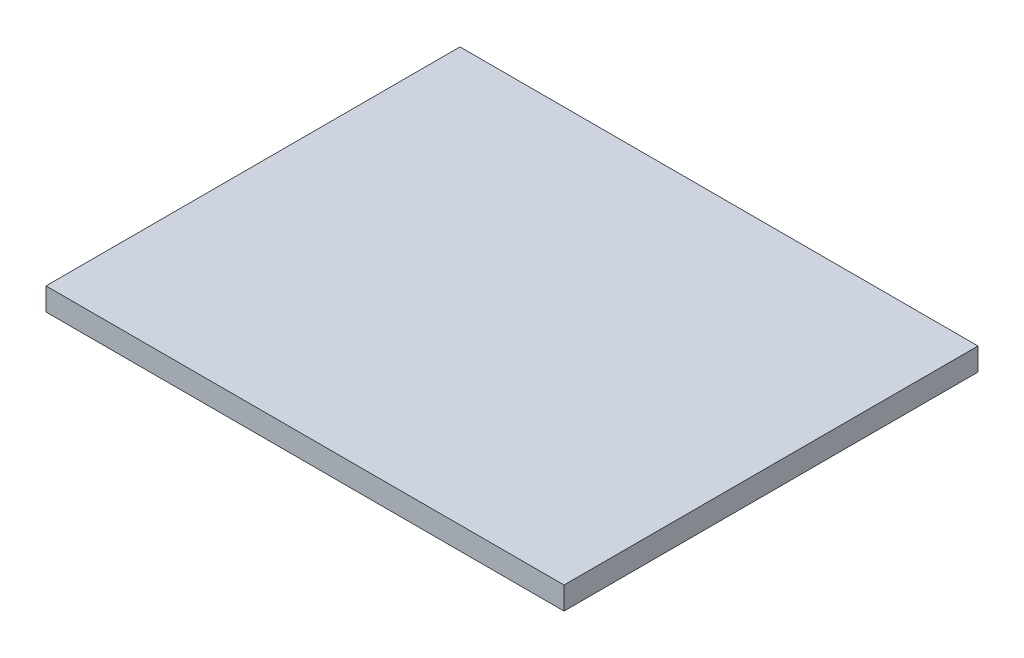
ISO-10303-21;
HEADER;
FILE_DESCRIPTION(('STEP AP214'),'2;1');
FILE_NAME('part.step','',(''),(''),'','','');
FILE_SCHEMA(('AUTOMOTIVE_DESIGN { 1 0 10303 214 1 1 1 1 }'));
ENDSEC;
DATA;
#1=APPLICATION_CONTEXT('core data for automotive mechanical design processes');
#2=APPLICATION_PROTOCOL_DEFINITION('international standard','automotive_design',2000,#1);
#3=PRODUCT_CONTEXT('',#1,'mechanical');
#4=PRODUCT('Part','Part','',(#3));
#5=PRODUCT_RELATED_PRODUCT_CATEGORY('part','',(#4));
#6=PRODUCT_DEFINITION_FORMATION('','',#4);
#7=PRODUCT_DEFINITION_CONTEXT('part definition',#1,'design');
#8=PRODUCT_DEFINITION('design','',#6,#7);
#9=PRODUCT_DEFINITION_SHAPE('','',#8);
#10=(LENGTH_UNIT() NAMED_UNIT(*) SI_UNIT(.MILLI.,.METRE.));
#11=(NAMED_UNIT(*) PLANE_ANGLE_UNIT() SI_UNIT($,.RADIAN.));
#12=(NAMED_UNIT(*) SI_UNIT($,.STERADIAN.) SOLID_ANGLE_UNIT());
#13=UNCERTAINTY_MEASURE_WITH_UNIT(LENGTH_MEASURE(1.E-05),#10,'distance_accuracy_value','');
#14=(GEOMETRIC_REPRESENTATION_CONTEXT(3) GLOBAL_UNCERTAINTY_ASSIGNED_CONTEXT((#13)) GLOBAL_UNIT_ASSIGNED_CONTEXT((#10,
#11,#12)) REPRESENTATION_CONTEXT('',''));
#15=CARTESIAN_POINT('',(0.,0.,0.));
#16=DIRECTION('',(0.,0.,1.));
#17=DIRECTION('',(1.,0.,0.));
#18=AXIS2_PLACEMENT_3D('',#15,#16,#17);
#19=CARTESIAN_POINT('',(-23.9,2.,-18.3));
#20=DIRECTION('',(1.,0.,0.));
#21=DIRECTION('',(0.,0.,-1.));
#22=AXIS2_PLACEMENT_3D('',#19,#20,#21);
#23=PLANE('',#22);
#24=DIRECTION('',(0.,0.,1.));
#25=VECTOR('',#24,1.);
#26=CARTESIAN_POINT('',(-23.9,0.,-18.3));
#27=LINE('',#26,#25);
#28=CARTESIAN_POINT('',(-23.9,0.,-18.3));
#29=VERTEX_POINT('',#28);
#30=CARTESIAN_POINT('',(-23.9,0.,18.3));
#31=VERTEX_POINT('',#30);
#32=EDGE_CURVE('E113',#29,#31,#27,.T.);
#33=ORIENTED_EDGE('',*,*,#32,.T.);
#34=DIRECTION('',(0.,-1.,0.));
#35=VECTOR('',#34,1.);
#36=CARTESIAN_POINT('',(-23.9,2.,18.3));
#37=LINE('',#36,#35);
#38=CARTESIAN_POINT('',(-23.9,2.,18.3));
#39=VERTEX_POINT('',#38);
#40=EDGE_CURVE('E11',#39,#31,#37,.T.);
#41=ORIENTED_EDGE('',*,*,#40,.F.);
#42=DIRECTION('',(0.,0.,1.));
#43=VECTOR('',#42,1.);
#44=CARTESIAN_POINT('',(-23.9,2.,-18.3));
#45=LINE('',#44,#43);
#46=CARTESIAN_POINT('',(-23.9,2.,-18.3));
#47=VERTEX_POINT('',#46);
#48=EDGE_CURVE('E97',#47,#39,#45,.T.);
#49=ORIENTED_EDGE('',*,*,#48,.F.);
#50=DIRECTION('',(0.,-1.,0.));
#51=VECTOR('',#50,1.);
#52=CARTESIAN_POINT('',(-23.9,2.,-18.3));
#53=LINE('',#52,#51);
#54=EDGE_CURVE('E109',#47,#29,#53,.T.);
#55=ORIENTED_EDGE('',*,*,#54,.T.);
#56=EDGE_LOOP('',(#33,#41,#49,#55));
#57=FACE_BOUND('',#56,.T.);
#58=ADVANCED_FACE('F45',(#57),#23,.F.);
#59=CARTESIAN_POINT('',(-23.9,2.,18.3));
#60=DIRECTION('',(0.,0.,-1.));
#61=DIRECTION('',(-1.,0.,0.));
#62=AXIS2_PLACEMENT_3D('',#59,#60,#61);
#63=PLANE('',#62);
#64=DIRECTION('',(1.,0.,0.));
#65=VECTOR('',#64,1.);
#66=CARTESIAN_POINT('',(-23.9,0.,18.3));
#67=LINE('',#66,#65);
#68=CARTESIAN_POINT('',(21.9,0.,18.3));
#69=VERTEX_POINT('',#68);
#70=EDGE_CURVE('E102',#31,#69,#67,.T.);
#71=ORIENTED_EDGE('',*,*,#70,.T.);
#72=DIRECTION('',(0.,-1.,0.));
#73=VECTOR('',#72,1.);
#74=CARTESIAN_POINT('',(21.9,2.,18.3));
#75=LINE('',#74,#73);
#76=CARTESIAN_POINT('',(21.9,2.,18.3));
#77=VERTEX_POINT('',#76);
#78=EDGE_CURVE('E54',#77,#69,#75,.T.);
#79=ORIENTED_EDGE('',*,*,#78,.F.);
#80=DIRECTION('',(1.,0.,0.));
#81=VECTOR('',#80,1.);
#82=CARTESIAN_POINT('',(-23.9,2.,18.3));
#83=LINE('',#82,#81);
#84=EDGE_CURVE('E92',#39,#77,#83,.T.);
#85=ORIENTED_EDGE('',*,*,#84,.F.);
#86=ORIENTED_EDGE('',*,*,#40,.T.);
#87=EDGE_LOOP('',(#71,#79,#85,#86));
#88=FACE_BOUND('',#87,.T.);
#89=ADVANCED_FACE('F101',(#88),#63,.F.);
#90=CARTESIAN_POINT('',(21.9,2.,-18.3));
#91=DIRECTION('',(-1.,0.,0.));
#92=DIRECTION('',(0.,0.,1.));
#93=AXIS2_PLACEMENT_3D('',#90,#91,#92);
#94=PLANE('',#93);
#95=DIRECTION('',(0.,0.,-1.));
#96=VECTOR('',#95,1.);
#97=CARTESIAN_POINT('',(21.9,0.,-18.3));
#98=LINE('',#97,#96);
#99=CARTESIAN_POINT('',(21.9,0.,-18.3));
#100=VERTEX_POINT('',#99);
#101=EDGE_CURVE('E79',#69,#100,#98,.T.);
#102=ORIENTED_EDGE('',*,*,#101,.T.);
#103=DIRECTION('',(0.,-1.,0.));
#104=VECTOR('',#103,1.);
#105=CARTESIAN_POINT('',(21.9,2.,-18.3));
#106=LINE('',#105,#104);
#107=CARTESIAN_POINT('',(21.9,2.,-18.3));
#108=VERTEX_POINT('',#107);
#109=EDGE_CURVE('E104',#108,#100,#106,.T.);
#110=ORIENTED_EDGE('',*,*,#109,.F.);
#111=DIRECTION('',(0.,0.,-1.));
#112=VECTOR('',#111,1.);
#113=CARTESIAN_POINT('',(21.9,2.,-18.3));
#114=LINE('',#113,#112);
#115=EDGE_CURVE('E95',#77,#108,#114,.T.);
#116=ORIENTED_EDGE('',*,*,#115,.F.);
#117=ORIENTED_EDGE('',*,*,#78,.T.);
#118=EDGE_LOOP('',(#102,#110,#116,#117));
#119=FACE_BOUND('',#118,.T.);
#120=ADVANCED_FACE('F105',(#119),#94,.F.);
#121=CARTESIAN_POINT('',(-23.9,2.,-18.3));
#122=DIRECTION('',(0.,0.,1.));
#123=DIRECTION('',(1.,0.,0.));
#124=AXIS2_PLACEMENT_3D('',#121,#122,#123);
#125=PLANE('',#124);
#126=DIRECTION('',(-1.,0.,0.));
#127=VECTOR('',#126,1.);
#128=CARTESIAN_POINT('',(-23.9,0.,-18.3));
#129=LINE('',#128,#127);
#130=EDGE_CURVE('E85',#100,#29,#129,.T.);
#131=ORIENTED_EDGE('',*,*,#130,.T.);
#132=ORIENTED_EDGE('',*,*,#54,.F.);
#133=DIRECTION('',(-1.,0.,0.));
#134=VECTOR('',#133,1.);
#135=CARTESIAN_POINT('',(-23.9,2.,-18.3));
#136=LINE('',#135,#134);
#137=EDGE_CURVE('E62',#108,#47,#136,.T.);
#138=ORIENTED_EDGE('',*,*,#137,.F.);
#139=ORIENTED_EDGE('',*,*,#109,.T.);
#140=EDGE_LOOP('',(#131,#132,#138,#139));
#141=FACE_BOUND('',#140,.T.);
#142=ADVANCED_FACE('F126',(#141),#125,.F.);
#143=CARTESIAN_POINT('',(0.,2.,0.));
#144=DIRECTION('',(0.,1.,0.));
#145=DIRECTION('',(0.,0.,1.));
#146=AXIS2_PLACEMENT_3D('',#143,#144,#145);
#147=PLANE('',#146);
#148=ORIENTED_EDGE('',*,*,#48,.T.);
#149=ORIENTED_EDGE('',*,*,#84,.T.);
#150=ORIENTED_EDGE('',*,*,#115,.T.);
#151=ORIENTED_EDGE('',*,*,#137,.T.);
#152=EDGE_LOOP('',(#148,#149,#150,#151));
#153=FACE_BOUND('',#152,.T.);
#154=ADVANCED_FACE('F93',(#153),#147,.T.);
#155=CARTESIAN_POINT('',(0.,0.,0.));
#156=DIRECTION('',(0.,1.,0.));
#157=DIRECTION('',(0.,0.,1.));
#158=AXIS2_PLACEMENT_3D('',#155,#156,#157);
#159=PLANE('',#158);
#160=ORIENTED_EDGE('',*,*,#32,.F.);
#161=ORIENTED_EDGE('',*,*,#130,.F.);
#162=ORIENTED_EDGE('',*,*,#101,.F.);
#163=ORIENTED_EDGE('',*,*,#70,.F.);
#164=EDGE_LOOP('',(#160,#161,#162,#163));
#165=FACE_BOUND('',#164,.T.);
#166=ADVANCED_FACE('F129',(#165),#159,.F.);
#167=CLOSED_SHELL('',(#58,#89,#120,#142,#154,#166));
#168=MANIFOLD_SOLID_BREP('B2',#167);
#169=ADVANCED_BREP_SHAPE_REPRESENTATION('',(#18,#168),#14);
#170=SHAPE_DEFINITION_REPRESENTATION(#9,#169);
ENDSEC;
END-ISO-10303-21;
